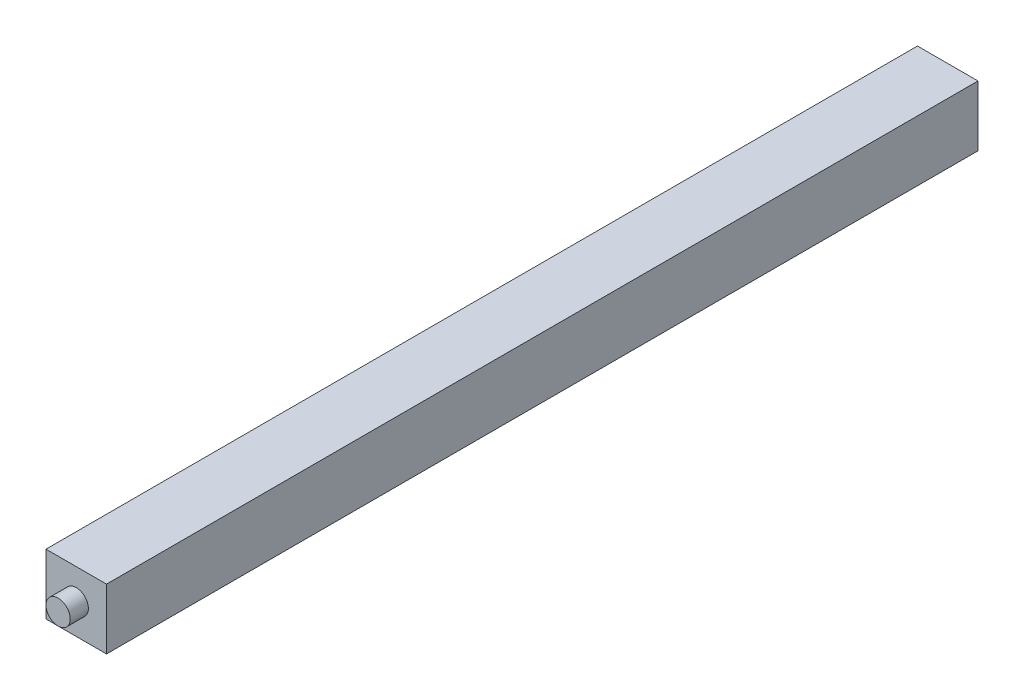
ISO-10303-21;
HEADER;
FILE_DESCRIPTION(('STEP AP214'),'2;1');
FILE_NAME('part.step','',(''),(''),'','','');
FILE_SCHEMA(('AUTOMOTIVE_DESIGN { 1 0 10303 214 1 1 1 1 }'));
ENDSEC;
DATA;
#1=APPLICATION_CONTEXT('core data for automotive mechanical design processes');
#2=APPLICATION_PROTOCOL_DEFINITION('international standard','automotive_design',2000,#1);
#3=PRODUCT_CONTEXT('',#1,'mechanical');
#4=PRODUCT('Part','Part','',(#3));
#5=PRODUCT_RELATED_PRODUCT_CATEGORY('part','',(#4));
#6=PRODUCT_DEFINITION_FORMATION('','',#4);
#7=PRODUCT_DEFINITION_CONTEXT('part definition',#1,'design');
#8=PRODUCT_DEFINITION('design','',#6,#7);
#9=PRODUCT_DEFINITION_SHAPE('','',#8);
#10=(LENGTH_UNIT() NAMED_UNIT(*) SI_UNIT(.MILLI.,.METRE.));
#11=(NAMED_UNIT(*) PLANE_ANGLE_UNIT() SI_UNIT($,.RADIAN.));
#12=(NAMED_UNIT(*) SI_UNIT($,.STERADIAN.) SOLID_ANGLE_UNIT());
#13=UNCERTAINTY_MEASURE_WITH_UNIT(LENGTH_MEASURE(1.E-05),#10,'distance_accuracy_value','');
#14=(GEOMETRIC_REPRESENTATION_CONTEXT(3) GLOBAL_UNCERTAINTY_ASSIGNED_CONTEXT((#13)) GLOBAL_UNIT_ASSIGNED_CONTEXT((#10,
#11,#12)) REPRESENTATION_CONTEXT('',''));
#15=CARTESIAN_POINT('',(0.,0.,0.));
#16=DIRECTION('',(0.,0.,1.));
#17=DIRECTION('',(1.,0.,0.));
#18=AXIS2_PLACEMENT_3D('',#15,#16,#17);
#19=CARTESIAN_POINT('',(25.,-25.,720.));
#20=DIRECTION('',(-1.,0.,0.));
#21=DIRECTION('',(0.,0.,1.));
#22=AXIS2_PLACEMENT_3D('',#19,#20,#21);
#23=PLANE('',#22);
#24=DIRECTION('',(0.,1.,0.));
#25=VECTOR('',#24,1.);
#26=CARTESIAN_POINT('',(25.,-25.,0.));
#27=LINE('',#26,#25);
#28=CARTESIAN_POINT('',(25.,-25.,0.));
#29=VERTEX_POINT('',#28);
#30=CARTESIAN_POINT('',(25.,25.,0.));
#31=VERTEX_POINT('',#30);
#32=EDGE_CURVE('E104',#29,#31,#27,.T.);
#33=ORIENTED_EDGE('',*,*,#32,.T.);
#34=DIRECTION('',(0.,0.,-1.));
#35=VECTOR('',#34,1.);
#36=CARTESIAN_POINT('',(25.,25.,720.));
#37=LINE('',#36,#35);
#38=CARTESIAN_POINT('',(25.,25.,720.));
#39=VERTEX_POINT('',#38);
#40=EDGE_CURVE('E45',#39,#31,#37,.T.);
#41=ORIENTED_EDGE('',*,*,#40,.F.);
#42=DIRECTION('',(0.,1.,0.));
#43=VECTOR('',#42,1.);
#44=CARTESIAN_POINT('',(25.,-25.,720.));
#45=LINE('',#44,#43);
#46=CARTESIAN_POINT('',(25.,-25.,720.));
#47=VERTEX_POINT('',#46);
#48=EDGE_CURVE('E95',#47,#39,#45,.T.);
#49=ORIENTED_EDGE('',*,*,#48,.F.);
#50=DIRECTION('',(0.,0.,-1.));
#51=VECTOR('',#50,1.);
#52=CARTESIAN_POINT('',(25.,-25.,720.));
#53=LINE('',#52,#51);
#54=EDGE_CURVE('E101',#47,#29,#53,.T.);
#55=ORIENTED_EDGE('',*,*,#54,.T.);
#56=EDGE_LOOP('',(#33,#41,#49,#55));
#57=FACE_BOUND('',#56,.T.);
#58=ADVANCED_FACE('F39',(#57),#23,.F.);
#59=CARTESIAN_POINT('',(-25.,25.,720.));
#60=DIRECTION('',(0.,-1.,0.));
#61=DIRECTION('',(0.,0.,-1.));
#62=AXIS2_PLACEMENT_3D('',#59,#60,#61);
#63=PLANE('',#62);
#64=DIRECTION('',(-1.,0.,0.));
#65=VECTOR('',#64,1.);
#66=CARTESIAN_POINT('',(-25.,25.,0.));
#67=LINE('',#66,#65);
#68=CARTESIAN_POINT('',(-25.,25.,0.));
#69=VERTEX_POINT('',#68);
#70=EDGE_CURVE('E100',#31,#69,#67,.T.);
#71=ORIENTED_EDGE('',*,*,#70,.T.);
#72=DIRECTION('',(0.,0.,-1.));
#73=VECTOR('',#72,1.);
#74=CARTESIAN_POINT('',(-25.,25.,720.));
#75=LINE('',#74,#73);
#76=CARTESIAN_POINT('',(-25.,25.,720.));
#77=VERTEX_POINT('',#76);
#78=EDGE_CURVE('E92',#77,#69,#75,.T.);
#79=ORIENTED_EDGE('',*,*,#78,.F.);
#80=DIRECTION('',(-1.,0.,0.));
#81=VECTOR('',#80,1.);
#82=CARTESIAN_POINT('',(-25.,25.,720.));
#83=LINE('',#82,#81);
#84=EDGE_CURVE('E87',#39,#77,#83,.T.);
#85=ORIENTED_EDGE('',*,*,#84,.F.);
#86=ORIENTED_EDGE('',*,*,#40,.T.);
#87=EDGE_LOOP('',(#71,#79,#85,#86));
#88=FACE_BOUND('',#87,.T.);
#89=ADVANCED_FACE('F96',(#88),#63,.F.);
#90=CARTESIAN_POINT('',(-25.,-25.,720.));
#91=DIRECTION('',(1.,0.,0.));
#92=DIRECTION('',(0.,0.,-1.));
#93=AXIS2_PLACEMENT_3D('',#90,#91,#92);
#94=PLANE('',#93);
#95=DIRECTION('',(0.,-1.,0.));
#96=VECTOR('',#95,1.);
#97=CARTESIAN_POINT('',(-25.,-25.,0.));
#98=LINE('',#97,#96);
#99=CARTESIAN_POINT('',(-25.,-25.,0.));
#100=VERTEX_POINT('',#99);
#101=EDGE_CURVE('E71',#69,#100,#98,.T.);
#102=ORIENTED_EDGE('',*,*,#101,.T.);
#103=DIRECTION('',(0.,0.,-1.));
#104=VECTOR('',#103,1.);
#105=CARTESIAN_POINT('',(-25.,-25.,720.));
#106=LINE('',#105,#104);
#107=CARTESIAN_POINT('',(-25.,-25.,720.));
#108=VERTEX_POINT('',#107);
#109=EDGE_CURVE('E98',#108,#100,#106,.T.);
#110=ORIENTED_EDGE('',*,*,#109,.F.);
#111=DIRECTION('',(0.,-1.,0.));
#112=VECTOR('',#111,1.);
#113=CARTESIAN_POINT('',(-25.,-25.,720.));
#114=LINE('',#113,#112);
#115=EDGE_CURVE('E89',#77,#108,#114,.T.);
#116=ORIENTED_EDGE('',*,*,#115,.F.);
#117=ORIENTED_EDGE('',*,*,#78,.T.);
#118=EDGE_LOOP('',(#102,#110,#116,#117));
#119=FACE_BOUND('',#118,.T.);
#120=ADVANCED_FACE('F97',(#119),#94,.F.);
#121=CARTESIAN_POINT('',(-25.,-25.,720.));
#122=DIRECTION('',(0.,1.,0.));
#123=DIRECTION('',(0.,0.,1.));
#124=AXIS2_PLACEMENT_3D('',#121,#122,#123);
#125=PLANE('',#124);
#126=DIRECTION('',(1.,0.,0.));
#127=VECTOR('',#126,1.);
#128=CARTESIAN_POINT('',(-25.,-25.,0.));
#129=LINE('',#128,#127);
#130=EDGE_CURVE('E80',#100,#29,#129,.T.);
#131=ORIENTED_EDGE('',*,*,#130,.T.);
#132=ORIENTED_EDGE('',*,*,#54,.F.);
#133=DIRECTION('',(1.,0.,0.));
#134=VECTOR('',#133,1.);
#135=CARTESIAN_POINT('',(-25.,-25.,720.));
#136=LINE('',#135,#134);
#137=EDGE_CURVE('E57',#108,#47,#136,.T.);
#138=ORIENTED_EDGE('',*,*,#137,.F.);
#139=ORIENTED_EDGE('',*,*,#109,.T.);
#140=EDGE_LOOP('',(#131,#132,#138,#139));
#141=FACE_BOUND('',#140,.T.);
#142=ADVANCED_FACE('F114',(#141),#125,.F.);
#143=CARTESIAN_POINT('',(0.,0.,720.));
#144=DIRECTION('',(0.,0.,-1.));
#145=DIRECTION('',(-1.,0.,0.));
#146=AXIS2_PLACEMENT_3D('',#143,#144,#145);
#147=PLANE('',#146);
#148=CARTESIAN_POINT('',(0.,0.,720.));
#149=DIRECTION('',(0.,0.,1.));
#150=DIRECTION('',(1.,0.,0.));
#151=AXIS2_PLACEMENT_3D('',#148,#149,#150);
#152=CIRCLE('',#151,10.);
#153=CARTESIAN_POINT('',(10.,0.,720.));
#154=VERTEX_POINT('',#153);
#155=EDGE_CURVE('E11',#154,#154,#152,.T.);
#156=ORIENTED_EDGE('',*,*,#155,.F.);
#157=EDGE_LOOP('',(#156));
#158=FACE_BOUND('',#157,.T.);
#159=ORIENTED_EDGE('',*,*,#48,.T.);
#160=ORIENTED_EDGE('',*,*,#84,.T.);
#161=ORIENTED_EDGE('',*,*,#115,.T.);
#162=ORIENTED_EDGE('',*,*,#137,.T.);
#163=EDGE_LOOP('',(#159,#160,#161,#162));
#164=FACE_BOUND('',#163,.T.);
#165=ADVANCED_FACE('F86',(#158,#164),#147,.F.);
#166=CARTESIAN_POINT('',(0.,0.,0.));
#167=DIRECTION('',(0.,0.,-1.));
#168=DIRECTION('',(-1.,0.,0.));
#169=AXIS2_PLACEMENT_3D('',#166,#167,#168);
#170=PLANE('',#169);
#171=ORIENTED_EDGE('',*,*,#32,.F.);
#172=ORIENTED_EDGE('',*,*,#130,.F.);
#173=ORIENTED_EDGE('',*,*,#101,.F.);
#174=ORIENTED_EDGE('',*,*,#70,.F.);
#175=EDGE_LOOP('',(#171,#172,#173,#174));
#176=FACE_BOUND('',#175,.T.);
#177=ADVANCED_FACE('F118',(#176),#170,.T.);
#178=CARTESIAN_POINT('',(0.,0.,735.));
#179=DIRECTION('',(0.,0.,-1.));
#180=DIRECTION('',(-1.,0.,0.));
#181=AXIS2_PLACEMENT_3D('',#178,#179,#180);
#182=CYLINDRICAL_SURFACE('',#181,10.);
#183=CARTESIAN_POINT('',(0.,0.,735.));
#184=DIRECTION('',(0.,0.,1.));
#185=DIRECTION('',(1.,0.,0.));
#186=AXIS2_PLACEMENT_3D('',#183,#184,#185);
#187=CIRCLE('',#186,10.);
#188=CARTESIAN_POINT('',(10.,0.,735.));
#189=VERTEX_POINT('',#188);
#190=EDGE_CURVE('E107',#189,#189,#187,.T.);
#191=ORIENTED_EDGE('',*,*,#190,.F.);
#192=EDGE_LOOP('',(#191));
#193=FACE_BOUND('',#192,.T.);
#194=ORIENTED_EDGE('',*,*,#155,.T.);
#195=EDGE_LOOP('',(#194));
#196=FACE_BOUND('',#195,.T.);
#197=ADVANCED_FACE('F122',(#193,#196),#182,.T.);
#198=CARTESIAN_POINT('',(0.,0.,735.));
#199=DIRECTION('',(0.,0.,1.));
#200=DIRECTION('',(1.,0.,0.));
#201=AXIS2_PLACEMENT_3D('',#198,#199,#200);
#202=PLANE('',#201);
#203=ORIENTED_EDGE('',*,*,#190,.T.);
#204=EDGE_LOOP('',(#203));
#205=FACE_BOUND('',#204,.T.);
#206=ADVANCED_FACE('F125',(#205),#202,.T.);
#207=CLOSED_SHELL('',(#58,#89,#120,#142,#165,#177,#197,#206));
#208=MANIFOLD_SOLID_BREP('B2',#207);
#209=ADVANCED_BREP_SHAPE_REPRESENTATION('',(#18,#208),#14);
#210=SHAPE_DEFINITION_REPRESENTATION(#9,#209);
ENDSEC;
END-ISO-10303-21;
